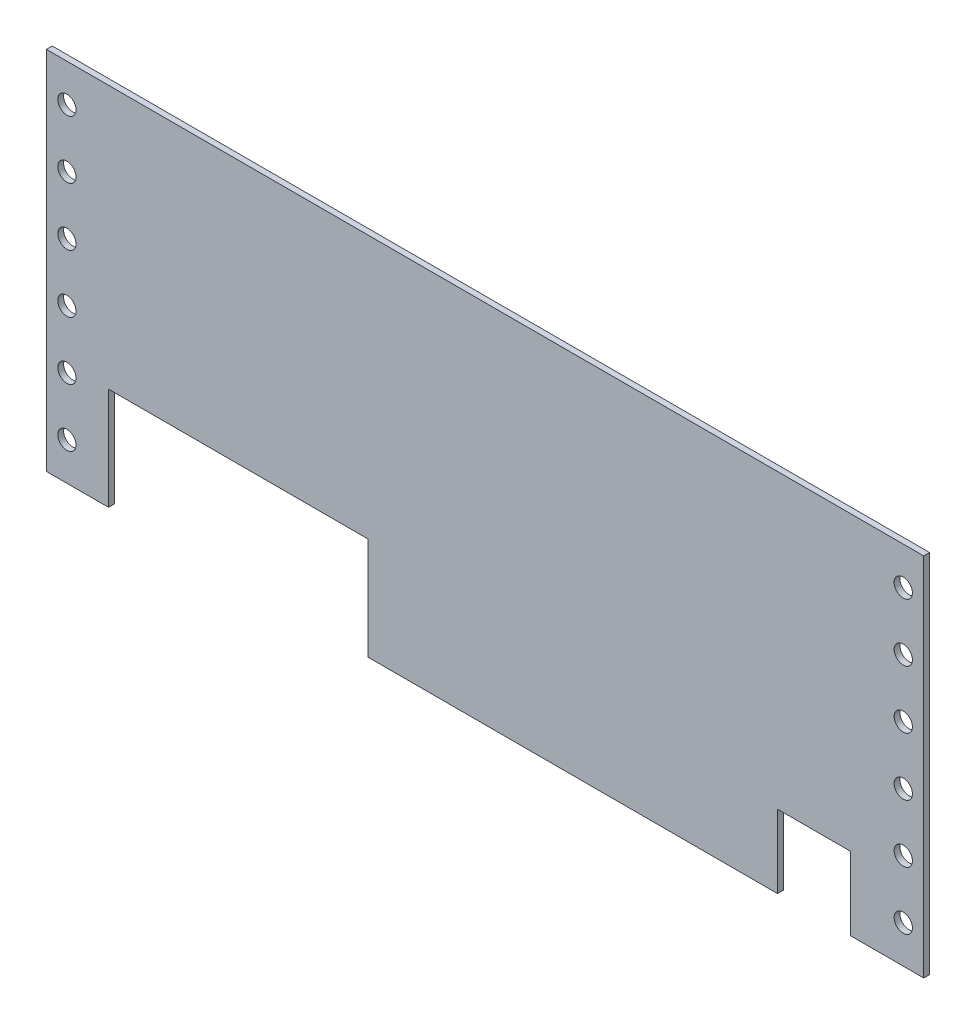
ISO-10303-21;
HEADER;
FILE_DESCRIPTION(('STEP AP214'),'2;1');
FILE_NAME('part.step','',(''),(''),'','','');
FILE_SCHEMA(('AUTOMOTIVE_DESIGN { 1 0 10303 214 1 1 1 1 }'));
ENDSEC;
DATA;
#1=APPLICATION_CONTEXT('core data for automotive mechanical design processes');
#2=APPLICATION_PROTOCOL_DEFINITION('international standard','automotive_design',2000,#1);
#3=PRODUCT_CONTEXT('',#1,'mechanical');
#4=PRODUCT('Part','Part','',(#3));
#5=PRODUCT_RELATED_PRODUCT_CATEGORY('part','',(#4));
#6=PRODUCT_DEFINITION_FORMATION('','',#4);
#7=PRODUCT_DEFINITION_CONTEXT('part definition',#1,'design');
#8=PRODUCT_DEFINITION('design','',#6,#7);
#9=PRODUCT_DEFINITION_SHAPE('','',#8);
#10=(LENGTH_UNIT() NAMED_UNIT(*) SI_UNIT(.MILLI.,.METRE.));
#11=(NAMED_UNIT(*) PLANE_ANGLE_UNIT() SI_UNIT($,.RADIAN.));
#12=(NAMED_UNIT(*) SI_UNIT($,.STERADIAN.) SOLID_ANGLE_UNIT());
#13=UNCERTAINTY_MEASURE_WITH_UNIT(LENGTH_MEASURE(1.E-05),#10,'distance_accuracy_value','');
#14=(GEOMETRIC_REPRESENTATION_CONTEXT(3) GLOBAL_UNCERTAINTY_ASSIGNED_CONTEXT((#13)) GLOBAL_UNIT_ASSIGNED_CONTEXT((#10,
#11,#12)) REPRESENTATION_CONTEXT('',''));
#15=CARTESIAN_POINT('',(0.,0.,0.));
#16=DIRECTION('',(0.,0.,1.));
#17=DIRECTION('',(1.,0.,0.));
#18=AXIS2_PLACEMENT_3D('',#15,#16,#17);
#19=CARTESIAN_POINT('',(0.,0.,1.6));
#20=DIRECTION('',(0.,1.,0.));
#21=DIRECTION('',(0.,0.,1.));
#22=AXIS2_PLACEMENT_3D('',#19,#20,#21);
#23=PLANE('',#22);
#24=DIRECTION('',(1.,0.,0.));
#25=VECTOR('',#24,1.);
#26=CARTESIAN_POINT('',(0.,0.,1.6));
#27=LINE('',#26,#25);
#28=CARTESIAN_POINT('',(220.,0.,1.6));
#29=VERTEX_POINT('',#28);
#30=CARTESIAN_POINT('',(240.,0.,1.6));
#31=VERTEX_POINT('',#30);
#32=EDGE_CURVE('E139',#29,#31,#27,.T.);
#33=ORIENTED_EDGE('',*,*,#32,.F.);
#34=DIRECTION('',(0.,0.,-1.));
#35=VECTOR('',#34,1.);
#36=CARTESIAN_POINT('',(220.,0.,1.601));
#37=LINE('',#36,#35);
#38=CARTESIAN_POINT('',(220.,0.,0.));
#39=VERTEX_POINT('',#38);
#40=EDGE_CURVE('E124',#29,#39,#37,.T.);
#41=ORIENTED_EDGE('',*,*,#40,.T.);
#42=DIRECTION('',(1.,0.,0.));
#43=VECTOR('',#42,1.);
#44=CARTESIAN_POINT('',(0.,0.,0.));
#45=LINE('',#44,#43);
#46=CARTESIAN_POINT('',(240.,0.,0.));
#47=VERTEX_POINT('',#46);
#48=EDGE_CURVE('E168',#39,#47,#45,.T.);
#49=ORIENTED_EDGE('',*,*,#48,.T.);
#50=DIRECTION('',(0.,0.,-1.));
#51=VECTOR('',#50,1.);
#52=CARTESIAN_POINT('',(240.,0.,1.6));
#53=LINE('',#52,#51);
#54=EDGE_CURVE('E146',#31,#47,#53,.T.);
#55=ORIENTED_EDGE('',*,*,#54,.F.);
#56=EDGE_LOOP('',(#33,#41,#49,#55));
#57=FACE_BOUND('',#56,.T.);
#58=ADVANCED_FACE('F34',(#57),#23,.F.);
#59=CARTESIAN_POINT('',(0.,0.,0.));
#60=VERTEX_POINT('',#59);
#61=CARTESIAN_POINT('',(17.,0.,0.));
#62=VERTEX_POINT('',#61);
#63=EDGE_CURVE('E170',#60,#62,#45,.T.);
#64=ORIENTED_EDGE('',*,*,#63,.T.);
#65=DIRECTION('',(0.,0.,1.));
#66=VECTOR('',#65,1.);
#67=CARTESIAN_POINT('',(17.,0.,-0.000999999999999916));
#68=LINE('',#67,#66);
#69=CARTESIAN_POINT('',(17.,0.,1.6));
#70=VERTEX_POINT('',#69);
#71=EDGE_CURVE('E290',#62,#70,#68,.T.);
#72=ORIENTED_EDGE('',*,*,#71,.T.);
#73=CARTESIAN_POINT('',(0.,0.,1.6));
#74=VERTEX_POINT('',#73);
#75=EDGE_CURVE('E151',#74,#70,#27,.T.);
#76=ORIENTED_EDGE('',*,*,#75,.F.);
#77=DIRECTION('',(0.,0.,-1.));
#78=VECTOR('',#77,1.);
#79=CARTESIAN_POINT('',(0.,0.,1.6));
#80=LINE('',#79,#78);
#81=EDGE_CURVE('E183',#74,#60,#80,.T.);
#82=ORIENTED_EDGE('',*,*,#81,.T.);
#83=EDGE_LOOP('',(#64,#72,#76,#82));
#84=FACE_BOUND('',#83,.T.);
#85=ADVANCED_FACE('F235',(#84),#23,.F.);
#86=CARTESIAN_POINT('',(234.4,89.7,-0.000999999999999916));
#87=DIRECTION('',(0.,0.,1.));
#88=DIRECTION('',(1.,0.,0.));
#89=AXIS2_PLACEMENT_3D('',#86,#87,#88);
#90=CYLINDRICAL_SURFACE('',#89,2.5);
#91=CARTESIAN_POINT('',(234.4,89.7,0.));
#92=DIRECTION('',(0.,0.,-1.));
#93=DIRECTION('',(-1.,0.,0.));
#94=AXIS2_PLACEMENT_3D('',#91,#92,#93);
#95=CIRCLE('',#94,2.5);
#96=CARTESIAN_POINT('',(231.9,89.7,0.));
#97=VERTEX_POINT('',#96);
#98=EDGE_CURVE('E42',#97,#97,#95,.F.);
#99=ORIENTED_EDGE('',*,*,#98,.F.);
#100=EDGE_LOOP('',(#99));
#101=FACE_BOUND('',#100,.T.);
#102=CARTESIAN_POINT('',(234.4,89.7,1.6));
#103=DIRECTION('',(0.,0.,1.));
#104=DIRECTION('',(1.,0.,0.));
#105=AXIS2_PLACEMENT_3D('',#102,#103,#104);
#106=CIRCLE('',#105,2.5);
#107=CARTESIAN_POINT('',(236.9,89.7,1.6));
#108=VERTEX_POINT('',#107);
#109=EDGE_CURVE('E11',#108,#108,#106,.T.);
#110=ORIENTED_EDGE('',*,*,#109,.T.);
#111=EDGE_LOOP('',(#110));
#112=FACE_BOUND('',#111,.T.);
#113=ADVANCED_FACE('F36',(#101,#112),#90,.F.);
#114=CARTESIAN_POINT('',(234.4,73.82,-0.000999999999999916));
#115=DIRECTION('',(0.,0.,1.));
#116=DIRECTION('',(1.,0.,0.));
#117=AXIS2_PLACEMENT_3D('',#114,#115,#116);
#118=CYLINDRICAL_SURFACE('',#117,2.5);
#119=CARTESIAN_POINT('',(234.4,73.82,0.));
#120=DIRECTION('',(0.,0.,-1.));
#121=DIRECTION('',(-1.,0.,0.));
#122=AXIS2_PLACEMENT_3D('',#119,#120,#121);
#123=CIRCLE('',#122,2.5);
#124=CARTESIAN_POINT('',(231.9,73.82,0.));
#125=VERTEX_POINT('',#124);
#126=EDGE_CURVE('E222',#125,#125,#123,.F.);
#127=ORIENTED_EDGE('',*,*,#126,.F.);
#128=EDGE_LOOP('',(#127));
#129=FACE_BOUND('',#128,.T.);
#130=CARTESIAN_POINT('',(234.4,73.82,1.6));
#131=DIRECTION('',(0.,0.,1.));
#132=DIRECTION('',(1.,0.,0.));
#133=AXIS2_PLACEMENT_3D('',#130,#131,#132);
#134=CIRCLE('',#133,2.5);
#135=CARTESIAN_POINT('',(236.9,73.82,1.6));
#136=VERTEX_POINT('',#135);
#137=EDGE_CURVE('E225',#136,#136,#134,.T.);
#138=ORIENTED_EDGE('',*,*,#137,.T.);
#139=EDGE_LOOP('',(#138));
#140=FACE_BOUND('',#139,.T.);
#141=ADVANCED_FACE('F234',(#129,#140),#118,.F.);
#142=CARTESIAN_POINT('',(234.4,57.94,-0.000999999999999916));
#143=DIRECTION('',(0.,0.,1.));
#144=DIRECTION('',(1.,0.,0.));
#145=AXIS2_PLACEMENT_3D('',#142,#143,#144);
#146=CYLINDRICAL_SURFACE('',#145,2.5);
#147=CARTESIAN_POINT('',(234.4,57.94,0.));
#148=DIRECTION('',(0.,0.,-1.));
#149=DIRECTION('',(-1.,0.,0.));
#150=AXIS2_PLACEMENT_3D('',#147,#148,#149);
#151=CIRCLE('',#150,2.5);
#152=CARTESIAN_POINT('',(231.9,57.94,0.));
#153=VERTEX_POINT('',#152);
#154=EDGE_CURVE('E216',#153,#153,#151,.F.);
#155=ORIENTED_EDGE('',*,*,#154,.F.);
#156=EDGE_LOOP('',(#155));
#157=FACE_BOUND('',#156,.T.);
#158=CARTESIAN_POINT('',(234.4,57.94,1.6));
#159=DIRECTION('',(0.,0.,1.));
#160=DIRECTION('',(1.,0.,0.));
#161=AXIS2_PLACEMENT_3D('',#158,#159,#160);
#162=CIRCLE('',#161,2.5);
#163=CARTESIAN_POINT('',(236.9,57.94,1.6));
#164=VERTEX_POINT('',#163);
#165=EDGE_CURVE('E219',#164,#164,#162,.T.);
#166=ORIENTED_EDGE('',*,*,#165,.T.);
#167=EDGE_LOOP('',(#166));
#168=FACE_BOUND('',#167,.T.);
#169=ADVANCED_FACE('F488',(#157,#168),#146,.F.);
#170=CARTESIAN_POINT('',(234.4,42.06,-0.000999999999999916));
#171=DIRECTION('',(0.,0.,1.));
#172=DIRECTION('',(1.,0.,0.));
#173=AXIS2_PLACEMENT_3D('',#170,#171,#172);
#174=CYLINDRICAL_SURFACE('',#173,2.5);
#175=CARTESIAN_POINT('',(234.4,42.06,0.));
#176=DIRECTION('',(0.,0.,-1.));
#177=DIRECTION('',(-1.,0.,0.));
#178=AXIS2_PLACEMENT_3D('',#175,#176,#177);
#179=CIRCLE('',#178,2.5);
#180=CARTESIAN_POINT('',(231.9,42.06,0.));
#181=VERTEX_POINT('',#180);
#182=EDGE_CURVE('E210',#181,#181,#179,.F.);
#183=ORIENTED_EDGE('',*,*,#182,.F.);
#184=EDGE_LOOP('',(#183));
#185=FACE_BOUND('',#184,.T.);
#186=CARTESIAN_POINT('',(234.4,42.06,1.6));
#187=DIRECTION('',(0.,0.,1.));
#188=DIRECTION('',(1.,0.,0.));
#189=AXIS2_PLACEMENT_3D('',#186,#187,#188);
#190=CIRCLE('',#189,2.5);
#191=CARTESIAN_POINT('',(236.9,42.06,1.6));
#192=VERTEX_POINT('',#191);
#193=EDGE_CURVE('E213',#192,#192,#190,.T.);
#194=ORIENTED_EDGE('',*,*,#193,.T.);
#195=EDGE_LOOP('',(#194));
#196=FACE_BOUND('',#195,.T.);
#197=ADVANCED_FACE('F479',(#185,#196),#174,.F.);
#198=CARTESIAN_POINT('',(5.6,89.7,-0.000999999999999916));
#199=DIRECTION('',(0.,0.,1.));
#200=DIRECTION('',(1.,0.,0.));
#201=AXIS2_PLACEMENT_3D('',#198,#199,#200);
#202=CYLINDRICAL_SURFACE('',#201,2.5);
#203=CARTESIAN_POINT('',(5.6,89.7,0.));
#204=DIRECTION('',(0.,0.,-1.));
#205=DIRECTION('',(-1.,0.,0.));
#206=AXIS2_PLACEMENT_3D('',#203,#204,#205);
#207=CIRCLE('',#206,2.5);
#208=CARTESIAN_POINT('',(3.1,89.7,0.));
#209=VERTEX_POINT('',#208);
#210=EDGE_CURVE('E204',#209,#209,#207,.F.);
#211=ORIENTED_EDGE('',*,*,#210,.F.);
#212=EDGE_LOOP('',(#211));
#213=FACE_BOUND('',#212,.T.);
#214=CARTESIAN_POINT('',(5.6,89.7,1.6));
#215=DIRECTION('',(0.,0.,1.));
#216=DIRECTION('',(1.,0.,0.));
#217=AXIS2_PLACEMENT_3D('',#214,#215,#216);
#218=CIRCLE('',#217,2.5);
#219=CARTESIAN_POINT('',(8.1,89.7,1.6));
#220=VERTEX_POINT('',#219);
#221=EDGE_CURVE('E207',#220,#220,#218,.T.);
#222=ORIENTED_EDGE('',*,*,#221,.T.);
#223=EDGE_LOOP('',(#222));
#224=FACE_BOUND('',#223,.T.);
#225=ADVANCED_FACE('F470',(#213,#224),#202,.F.);
#226=CARTESIAN_POINT('',(5.6,73.82,-0.000999999999999916));
#227=DIRECTION('',(0.,0.,1.));
#228=DIRECTION('',(1.,0.,0.));
#229=AXIS2_PLACEMENT_3D('',#226,#227,#228);
#230=CYLINDRICAL_SURFACE('',#229,2.5);
#231=CARTESIAN_POINT('',(5.6,73.82,0.));
#232=DIRECTION('',(0.,0.,-1.));
#233=DIRECTION('',(-1.,0.,0.));
#234=AXIS2_PLACEMENT_3D('',#231,#232,#233);
#235=CIRCLE('',#234,2.5);
#236=CARTESIAN_POINT('',(3.1,73.82,0.));
#237=VERTEX_POINT('',#236);
#238=EDGE_CURVE('E198',#237,#237,#235,.F.);
#239=ORIENTED_EDGE('',*,*,#238,.F.);
#240=EDGE_LOOP('',(#239));
#241=FACE_BOUND('',#240,.T.);
#242=CARTESIAN_POINT('',(5.6,73.82,1.6));
#243=DIRECTION('',(0.,0.,1.));
#244=DIRECTION('',(1.,0.,0.));
#245=AXIS2_PLACEMENT_3D('',#242,#243,#244);
#246=CIRCLE('',#245,2.5);
#247=CARTESIAN_POINT('',(8.1,73.82,1.6));
#248=VERTEX_POINT('',#247);
#249=EDGE_CURVE('E201',#248,#248,#246,.T.);
#250=ORIENTED_EDGE('',*,*,#249,.T.);
#251=EDGE_LOOP('',(#250));
#252=FACE_BOUND('',#251,.T.);
#253=ADVANCED_FACE('F461',(#241,#252),#230,.F.);
#254=CARTESIAN_POINT('',(5.6,57.94,-0.000999999999999916));
#255=DIRECTION('',(0.,0.,1.));
#256=DIRECTION('',(1.,0.,0.));
#257=AXIS2_PLACEMENT_3D('',#254,#255,#256);
#258=CYLINDRICAL_SURFACE('',#257,2.5);
#259=CARTESIAN_POINT('',(5.6,57.94,0.));
#260=DIRECTION('',(0.,0.,-1.));
#261=DIRECTION('',(-1.,0.,0.));
#262=AXIS2_PLACEMENT_3D('',#259,#260,#261);
#263=CIRCLE('',#262,2.5);
#264=CARTESIAN_POINT('',(3.1,57.94,0.));
#265=VERTEX_POINT('',#264);
#266=EDGE_CURVE('E192',#265,#265,#263,.F.);
#267=ORIENTED_EDGE('',*,*,#266,.F.);
#268=EDGE_LOOP('',(#267));
#269=FACE_BOUND('',#268,.T.);
#270=CARTESIAN_POINT('',(5.6,57.94,1.6));
#271=DIRECTION('',(0.,0.,1.));
#272=DIRECTION('',(1.,0.,0.));
#273=AXIS2_PLACEMENT_3D('',#270,#271,#272);
#274=CIRCLE('',#273,2.5);
#275=CARTESIAN_POINT('',(8.1,57.94,1.6));
#276=VERTEX_POINT('',#275);
#277=EDGE_CURVE('E195',#276,#276,#274,.T.);
#278=ORIENTED_EDGE('',*,*,#277,.T.);
#279=EDGE_LOOP('',(#278));
#280=FACE_BOUND('',#279,.T.);
#281=ADVANCED_FACE('F452',(#269,#280),#258,.F.);
#282=CARTESIAN_POINT('',(5.6,42.06,-0.000999999999999916));
#283=DIRECTION('',(0.,0.,1.));
#284=DIRECTION('',(1.,0.,0.));
#285=AXIS2_PLACEMENT_3D('',#282,#283,#284);
#286=CYLINDRICAL_SURFACE('',#285,2.5);
#287=CARTESIAN_POINT('',(5.6,42.06,0.));
#288=DIRECTION('',(0.,0.,-1.));
#289=DIRECTION('',(-1.,0.,0.));
#290=AXIS2_PLACEMENT_3D('',#287,#288,#289);
#291=CIRCLE('',#290,2.5);
#292=CARTESIAN_POINT('',(3.1,42.06,0.));
#293=VERTEX_POINT('',#292);
#294=EDGE_CURVE('E186',#293,#293,#291,.F.);
#295=ORIENTED_EDGE('',*,*,#294,.F.);
#296=EDGE_LOOP('',(#295));
#297=FACE_BOUND('',#296,.T.);
#298=CARTESIAN_POINT('',(5.6,42.06,1.6));
#299=DIRECTION('',(0.,0.,1.));
#300=DIRECTION('',(1.,0.,0.));
#301=AXIS2_PLACEMENT_3D('',#298,#299,#300);
#302=CIRCLE('',#301,2.5);
#303=CARTESIAN_POINT('',(8.1,42.06,1.6));
#304=VERTEX_POINT('',#303);
#305=EDGE_CURVE('E189',#304,#304,#302,.T.);
#306=ORIENTED_EDGE('',*,*,#305,.T.);
#307=EDGE_LOOP('',(#306));
#308=FACE_BOUND('',#307,.T.);
#309=ADVANCED_FACE('F273',(#297,#308),#286,.F.);
#310=CARTESIAN_POINT('',(0.,0.,1.6));
#311=DIRECTION('',(1.,0.,0.));
#312=DIRECTION('',(0.,0.,-1.));
#313=AXIS2_PLACEMENT_3D('',#310,#311,#312);
#314=PLANE('',#313);
#315=DIRECTION('',(0.,-1.,0.));
#316=VECTOR('',#315,1.);
#317=CARTESIAN_POINT('',(0.,0.,0.));
#318=LINE('',#317,#316);
#319=CARTESIAN_POINT('',(0.,100.,0.));
#320=VERTEX_POINT('',#319);
#321=EDGE_CURVE('E165',#320,#60,#318,.T.);
#322=ORIENTED_EDGE('',*,*,#321,.T.);
#323=ORIENTED_EDGE('',*,*,#81,.F.);
#324=DIRECTION('',(0.,-1.,0.));
#325=VECTOR('',#324,1.);
#326=CARTESIAN_POINT('',(0.,0.,1.6));
#327=LINE('',#326,#325);
#328=CARTESIAN_POINT('',(0.,100.,1.6));
#329=VERTEX_POINT('',#328);
#330=EDGE_CURVE('E149',#329,#74,#327,.T.);
#331=ORIENTED_EDGE('',*,*,#330,.F.);
#332=DIRECTION('',(0.,0.,-1.));
#333=VECTOR('',#332,1.);
#334=CARTESIAN_POINT('',(0.,100.,1.6));
#335=LINE('',#334,#333);
#336=EDGE_CURVE('E162',#329,#320,#335,.T.);
#337=ORIENTED_EDGE('',*,*,#336,.T.);
#338=EDGE_LOOP('',(#322,#323,#331,#337));
#339=FACE_BOUND('',#338,.T.);
#340=ADVANCED_FACE('F266',(#339),#314,.F.);
#341=CARTESIAN_POINT('',(88.,0.,0.));
#342=VERTEX_POINT('',#341);
#343=CARTESIAN_POINT('',(200.,0.,0.));
#344=VERTEX_POINT('',#343);
#345=EDGE_CURVE('E174',#342,#344,#45,.T.);
#346=ORIENTED_EDGE('',*,*,#345,.T.);
#347=DIRECTION('',(0.,0.,-1.));
#348=VECTOR('',#347,1.);
#349=CARTESIAN_POINT('',(200.,0.,1.601));
#350=LINE('',#349,#348);
#351=CARTESIAN_POINT('',(200.,0.,1.6));
#352=VERTEX_POINT('',#351);
#353=EDGE_CURVE('E49',#352,#344,#350,.T.);
#354=ORIENTED_EDGE('',*,*,#353,.F.);
#355=CARTESIAN_POINT('',(88.,0.,1.6));
#356=VERTEX_POINT('',#355);
#357=EDGE_CURVE('E148',#356,#352,#27,.T.);
#358=ORIENTED_EDGE('',*,*,#357,.F.);
#359=DIRECTION('',(0.,0.,1.));
#360=VECTOR('',#359,1.);
#361=CARTESIAN_POINT('',(88.,0.,-0.000999999999999916));
#362=LINE('',#361,#360);
#363=EDGE_CURVE('E279',#342,#356,#362,.T.);
#364=ORIENTED_EDGE('',*,*,#363,.F.);
#365=EDGE_LOOP('',(#346,#354,#358,#364));
#366=FACE_BOUND('',#365,.T.);
#367=ADVANCED_FACE('F258',(#366),#23,.F.);
#368=CARTESIAN_POINT('',(240.,0.,1.6));
#369=DIRECTION('',(-1.,0.,0.));
#370=DIRECTION('',(0.,0.,1.));
#371=AXIS2_PLACEMENT_3D('',#368,#369,#370);
#372=PLANE('',#371);
#373=DIRECTION('',(0.,1.,0.));
#374=VECTOR('',#373,1.);
#375=CARTESIAN_POINT('',(240.,0.,0.));
#376=LINE('',#375,#374);
#377=CARTESIAN_POINT('',(240.,100.,0.));
#378=VERTEX_POINT('',#377);
#379=EDGE_CURVE('E173',#47,#378,#376,.T.);
#380=ORIENTED_EDGE('',*,*,#379,.T.);
#381=DIRECTION('',(0.,0.,-1.));
#382=VECTOR('',#381,1.);
#383=CARTESIAN_POINT('',(240.,100.,1.6));
#384=LINE('',#383,#382);
#385=CARTESIAN_POINT('',(240.,100.,1.6));
#386=VERTEX_POINT('',#385);
#387=EDGE_CURVE('E179',#386,#378,#384,.T.);
#388=ORIENTED_EDGE('',*,*,#387,.F.);
#389=DIRECTION('',(0.,1.,0.));
#390=VECTOR('',#389,1.);
#391=CARTESIAN_POINT('',(240.,0.,1.6));
#392=LINE('',#391,#390);
#393=EDGE_CURVE('E158',#31,#386,#392,.T.);
#394=ORIENTED_EDGE('',*,*,#393,.F.);
#395=ORIENTED_EDGE('',*,*,#54,.T.);
#396=EDGE_LOOP('',(#380,#388,#394,#395));
#397=FACE_BOUND('',#396,.T.);
#398=ADVANCED_FACE('F250',(#397),#372,.F.);
#399=CARTESIAN_POINT('',(0.,100.,1.6));
#400=DIRECTION('',(0.,-1.,0.));
#401=DIRECTION('',(0.,0.,-1.));
#402=AXIS2_PLACEMENT_3D('',#399,#400,#401);
#403=PLANE('',#402);
#404=DIRECTION('',(-1.,0.,0.));
#405=VECTOR('',#404,1.);
#406=CARTESIAN_POINT('',(0.,100.,0.));
#407=LINE('',#406,#405);
#408=EDGE_CURVE('E154',#378,#320,#407,.T.);
#409=ORIENTED_EDGE('',*,*,#408,.T.);
#410=ORIENTED_EDGE('',*,*,#336,.F.);
#411=DIRECTION('',(-1.,0.,0.));
#412=VECTOR('',#411,1.);
#413=CARTESIAN_POINT('',(0.,100.,1.6));
#414=LINE('',#413,#412);
#415=EDGE_CURVE('E160',#386,#329,#414,.T.);
#416=ORIENTED_EDGE('',*,*,#415,.F.);
#417=ORIENTED_EDGE('',*,*,#387,.T.);
#418=EDGE_LOOP('',(#409,#410,#416,#417));
#419=FACE_BOUND('',#418,.T.);
#420=ADVANCED_FACE('F239',(#419),#403,.F.);
#421=CARTESIAN_POINT('',(0.,0.,1.6));
#422=DIRECTION('',(0.,0.,-1.));
#423=DIRECTION('',(-1.,0.,0.));
#424=AXIS2_PLACEMENT_3D('',#421,#422,#423);
#425=PLANE('',#424);
#426=CARTESIAN_POINT('',(234.4,26.18,1.6));
#427=DIRECTION('',(0.,0.,1.));
#428=DIRECTION('',(1.,0.,0.));
#429=AXIS2_PLACEMENT_3D('',#426,#427,#428);
#430=CIRCLE('',#429,2.5);
#431=CARTESIAN_POINT('',(236.9,26.18,1.6));
#432=VERTEX_POINT('',#431);
#433=EDGE_CURVE('E304',#432,#432,#430,.T.);
#434=ORIENTED_EDGE('',*,*,#433,.F.);
#435=EDGE_LOOP('',(#434));
#436=FACE_BOUND('',#435,.T.);
#437=CARTESIAN_POINT('',(5.6,26.18,1.6));
#438=DIRECTION('',(0.,0.,1.));
#439=DIRECTION('',(1.,0.,0.));
#440=AXIS2_PLACEMENT_3D('',#437,#438,#439);
#441=CIRCLE('',#440,2.5);
#442=CARTESIAN_POINT('',(8.1,26.18,1.6));
#443=VERTEX_POINT('',#442);
#444=EDGE_CURVE('E311',#443,#443,#441,.T.);
#445=ORIENTED_EDGE('',*,*,#444,.F.);
#446=EDGE_LOOP('',(#445));
#447=FACE_BOUND('',#446,.T.);
#448=CARTESIAN_POINT('',(5.6,10.3,1.6));
#449=DIRECTION('',(0.,0.,1.));
#450=DIRECTION('',(1.,0.,0.));
#451=AXIS2_PLACEMENT_3D('',#448,#449,#450);
#452=CIRCLE('',#451,2.5);
#453=CARTESIAN_POINT('',(8.1,10.3,1.6));
#454=VERTEX_POINT('',#453);
#455=EDGE_CURVE('E169',#454,#454,#452,.T.);
#456=ORIENTED_EDGE('',*,*,#455,.F.);
#457=EDGE_LOOP('',(#456));
#458=FACE_BOUND('',#457,.T.);
#459=CARTESIAN_POINT('',(234.4,10.3,1.6));
#460=DIRECTION('',(0.,0.,1.));
#461=DIRECTION('',(1.,0.,0.));
#462=AXIS2_PLACEMENT_3D('',#459,#460,#461);
#463=CIRCLE('',#462,2.5);
#464=CARTESIAN_POINT('',(236.9,10.3,1.6));
#465=VERTEX_POINT('',#464);
#466=EDGE_CURVE('E320',#465,#465,#463,.T.);
#467=ORIENTED_EDGE('',*,*,#466,.F.);
#468=EDGE_LOOP('',(#467));
#469=FACE_BOUND('',#468,.T.);
#470=DIRECTION('',(-1.,0.,0.));
#471=VECTOR('',#470,1.);
#472=CARTESIAN_POINT('',(220.,20.,1.6));
#473=LINE('',#472,#471);
#474=CARTESIAN_POINT('',(220.,20.,1.6));
#475=VERTEX_POINT('',#474);
#476=CARTESIAN_POINT('',(200.,20.,1.6));
#477=VERTEX_POINT('',#476);
#478=EDGE_CURVE('E143',#475,#477,#473,.T.);
#479=ORIENTED_EDGE('',*,*,#478,.F.);
#480=DIRECTION('',(0.,1.,0.));
#481=VECTOR('',#480,1.);
#482=CARTESIAN_POINT('',(220.,0.,1.6));
#483=LINE('',#482,#481);
#484=EDGE_CURVE('E127',#29,#475,#483,.T.);
#485=ORIENTED_EDGE('',*,*,#484,.F.);
#486=ORIENTED_EDGE('',*,*,#32,.T.);
#487=ORIENTED_EDGE('',*,*,#393,.T.);
#488=ORIENTED_EDGE('',*,*,#415,.T.);
#489=ORIENTED_EDGE('',*,*,#330,.T.);
#490=ORIENTED_EDGE('',*,*,#75,.T.);
#491=DIRECTION('',(0.,-1.,0.));
#492=VECTOR('',#491,1.);
#493=CARTESIAN_POINT('',(17.,28.,1.6));
#494=LINE('',#493,#492);
#495=CARTESIAN_POINT('',(17.,28.,1.6));
#496=VERTEX_POINT('',#495);
#497=EDGE_CURVE('E390',#496,#70,#494,.T.);
#498=ORIENTED_EDGE('',*,*,#497,.F.);
#499=DIRECTION('',(-1.,0.,0.));
#500=VECTOR('',#499,1.);
#501=CARTESIAN_POINT('',(17.,28.,1.6));
#502=LINE('',#501,#500);
#503=CARTESIAN_POINT('',(88.,28.,1.6));
#504=VERTEX_POINT('',#503);
#505=EDGE_CURVE('E293',#504,#496,#502,.T.);
#506=ORIENTED_EDGE('',*,*,#505,.F.);
#507=DIRECTION('',(0.,1.,0.));
#508=VECTOR('',#507,1.);
#509=CARTESIAN_POINT('',(88.,28.,1.6));
#510=LINE('',#509,#508);
#511=EDGE_CURVE('E297',#356,#504,#510,.T.);
#512=ORIENTED_EDGE('',*,*,#511,.F.);
#513=ORIENTED_EDGE('',*,*,#357,.T.);
#514=DIRECTION('',(0.,-1.,0.));
#515=VECTOR('',#514,1.);
#516=CARTESIAN_POINT('',(200.,0.,1.6));
#517=LINE('',#516,#515);
#518=EDGE_CURVE('E371',#477,#352,#517,.T.);
#519=ORIENTED_EDGE('',*,*,#518,.F.);
#520=EDGE_LOOP('',(#479,#485,#486,#487,#488,#489,#490,#498,#506,#512,#513,#519));
#521=FACE_BOUND('',#520,.T.);
#522=ORIENTED_EDGE('',*,*,#305,.F.);
#523=EDGE_LOOP('',(#522));
#524=FACE_BOUND('',#523,.T.);
#525=ORIENTED_EDGE('',*,*,#277,.F.);
#526=EDGE_LOOP('',(#525));
#527=FACE_BOUND('',#526,.T.);
#528=ORIENTED_EDGE('',*,*,#249,.F.);
#529=EDGE_LOOP('',(#528));
#530=FACE_BOUND('',#529,.T.);
#531=ORIENTED_EDGE('',*,*,#221,.F.);
#532=EDGE_LOOP('',(#531));
#533=FACE_BOUND('',#532,.T.);
#534=ORIENTED_EDGE('',*,*,#193,.F.);
#535=EDGE_LOOP('',(#534));
#536=FACE_BOUND('',#535,.T.);
#537=ORIENTED_EDGE('',*,*,#165,.F.);
#538=EDGE_LOOP('',(#537));
#539=FACE_BOUND('',#538,.T.);
#540=ORIENTED_EDGE('',*,*,#137,.F.);
#541=EDGE_LOOP('',(#540));
#542=FACE_BOUND('',#541,.T.);
#543=ORIENTED_EDGE('',*,*,#109,.F.);
#544=EDGE_LOOP('',(#543));
#545=FACE_BOUND('',#544,.T.);
#546=ADVANCED_FACE('F137',(#436,#447,#458,#469,#521,#524,#527,#530,#533,#536,#539,#542,#545),
#425,.F.);
#547=CARTESIAN_POINT('',(0.,0.,0.));
#548=DIRECTION('',(0.,0.,-1.));
#549=DIRECTION('',(-1.,0.,0.));
#550=AXIS2_PLACEMENT_3D('',#547,#548,#549);
#551=PLANE('',#550);
#552=DIRECTION('',(0.,-1.,0.));
#553=VECTOR('',#552,1.);
#554=CARTESIAN_POINT('',(220.,0.,0.));
#555=LINE('',#554,#553);
#556=CARTESIAN_POINT('',(220.,20.,0.));
#557=VERTEX_POINT('',#556);
#558=EDGE_CURVE('E130',#557,#39,#555,.T.);
#559=ORIENTED_EDGE('',*,*,#558,.F.);
#560=DIRECTION('',(1.,0.,0.));
#561=VECTOR('',#560,1.);
#562=CARTESIAN_POINT('',(220.,20.,0.));
#563=LINE('',#562,#561);
#564=CARTESIAN_POINT('',(200.,20.,0.));
#565=VERTEX_POINT('',#564);
#566=EDGE_CURVE('E134',#565,#557,#563,.T.);
#567=ORIENTED_EDGE('',*,*,#566,.F.);
#568=DIRECTION('',(0.,1.,0.));
#569=VECTOR('',#568,1.);
#570=CARTESIAN_POINT('',(200.,0.,0.));
#571=LINE('',#570,#569);
#572=EDGE_CURVE('E377',#344,#565,#571,.T.);
#573=ORIENTED_EDGE('',*,*,#572,.F.);
#574=ORIENTED_EDGE('',*,*,#345,.F.);
#575=DIRECTION('',(0.,1.,0.));
#576=VECTOR('',#575,1.);
#577=CARTESIAN_POINT('',(88.,28.,0.));
#578=LINE('',#577,#576);
#579=CARTESIAN_POINT('',(88.,28.,0.));
#580=VERTEX_POINT('',#579);
#581=EDGE_CURVE('E381',#342,#580,#578,.T.);
#582=ORIENTED_EDGE('',*,*,#581,.T.);
#583=DIRECTION('',(-1.,0.,0.));
#584=VECTOR('',#583,1.);
#585=CARTESIAN_POINT('',(17.,28.,0.));
#586=LINE('',#585,#584);
#587=CARTESIAN_POINT('',(17.,28.,0.));
#588=VERTEX_POINT('',#587);
#589=EDGE_CURVE('E385',#580,#588,#586,.T.);
#590=ORIENTED_EDGE('',*,*,#589,.T.);
#591=DIRECTION('',(0.,-1.,0.));
#592=VECTOR('',#591,1.);
#593=CARTESIAN_POINT('',(17.,28.,0.));
#594=LINE('',#593,#592);
#595=EDGE_CURVE('E388',#588,#62,#594,.T.);
#596=ORIENTED_EDGE('',*,*,#595,.T.);
#597=ORIENTED_EDGE('',*,*,#63,.F.);
#598=ORIENTED_EDGE('',*,*,#321,.F.);
#599=ORIENTED_EDGE('',*,*,#408,.F.);
#600=ORIENTED_EDGE('',*,*,#379,.F.);
#601=ORIENTED_EDGE('',*,*,#48,.F.);
#602=EDGE_LOOP('',(#559,#567,#573,#574,#582,#590,#596,#597,#598,#599,#600,#601));
#603=FACE_BOUND('',#602,.T.);
#604=CARTESIAN_POINT('',(234.4,26.18,0.));
#605=DIRECTION('',(0.,0.,-1.));
#606=DIRECTION('',(-1.,0.,0.));
#607=AXIS2_PLACEMENT_3D('',#604,#605,#606);
#608=CIRCLE('',#607,2.5);
#609=CARTESIAN_POINT('',(231.9,26.18,0.));
#610=VERTEX_POINT('',#609);
#611=EDGE_CURVE('E301',#610,#610,#608,.F.);
#612=ORIENTED_EDGE('',*,*,#611,.T.);
#613=EDGE_LOOP('',(#612));
#614=FACE_BOUND('',#613,.T.);
#615=CARTESIAN_POINT('',(5.6,26.18,0.));
#616=DIRECTION('',(0.,0.,-1.));
#617=DIRECTION('',(-1.,0.,0.));
#618=AXIS2_PLACEMENT_3D('',#615,#616,#617);
#619=CIRCLE('',#618,2.5);
#620=CARTESIAN_POINT('',(3.1,26.18,0.));
#621=VERTEX_POINT('',#620);
#622=EDGE_CURVE('E308',#621,#621,#619,.F.);
#623=ORIENTED_EDGE('',*,*,#622,.T.);
#624=EDGE_LOOP('',(#623));
#625=FACE_BOUND('',#624,.T.);
#626=CARTESIAN_POINT('',(5.6,10.3,0.));
#627=DIRECTION('',(0.,0.,-1.));
#628=DIRECTION('',(-1.,0.,0.));
#629=AXIS2_PLACEMENT_3D('',#626,#627,#628);
#630=CIRCLE('',#629,2.5);
#631=CARTESIAN_POINT('',(3.1,10.3,0.));
#632=VERTEX_POINT('',#631);
#633=EDGE_CURVE('E317',#632,#632,#630,.F.);
#634=ORIENTED_EDGE('',*,*,#633,.T.);
#635=EDGE_LOOP('',(#634));
#636=FACE_BOUND('',#635,.T.);
#637=CARTESIAN_POINT('',(234.4,10.3,0.));
#638=DIRECTION('',(0.,0.,-1.));
#639=DIRECTION('',(-1.,0.,0.));
#640=AXIS2_PLACEMENT_3D('',#637,#638,#639);
#641=CIRCLE('',#640,2.5);
#642=CARTESIAN_POINT('',(231.9,10.3,0.));
#643=VERTEX_POINT('',#642);
#644=EDGE_CURVE('E314',#643,#643,#641,.F.);
#645=ORIENTED_EDGE('',*,*,#644,.T.);
#646=EDGE_LOOP('',(#645));
#647=FACE_BOUND('',#646,.T.);
#648=ORIENTED_EDGE('',*,*,#294,.T.);
#649=EDGE_LOOP('',(#648));
#650=FACE_BOUND('',#649,.T.);
#651=ORIENTED_EDGE('',*,*,#266,.T.);
#652=EDGE_LOOP('',(#651));
#653=FACE_BOUND('',#652,.T.);
#654=ORIENTED_EDGE('',*,*,#238,.T.);
#655=EDGE_LOOP('',(#654));
#656=FACE_BOUND('',#655,.T.);
#657=ORIENTED_EDGE('',*,*,#210,.T.);
#658=EDGE_LOOP('',(#657));
#659=FACE_BOUND('',#658,.T.);
#660=ORIENTED_EDGE('',*,*,#182,.T.);
#661=EDGE_LOOP('',(#660));
#662=FACE_BOUND('',#661,.T.);
#663=ORIENTED_EDGE('',*,*,#154,.T.);
#664=EDGE_LOOP('',(#663));
#665=FACE_BOUND('',#664,.T.);
#666=ORIENTED_EDGE('',*,*,#126,.T.);
#667=EDGE_LOOP('',(#666));
#668=FACE_BOUND('',#667,.T.);
#669=ORIENTED_EDGE('',*,*,#98,.T.);
#670=EDGE_LOOP('',(#669));
#671=FACE_BOUND('',#670,.T.);
#672=ADVANCED_FACE('F230',(#603,#614,#625,#636,#647,#650,#653,#656,#659,#662,#665,#668,#671),
#551,.T.);
#673=CARTESIAN_POINT('',(234.4,10.3,-0.000999999999999916));
#674=DIRECTION('',(0.,0.,1.));
#675=DIRECTION('',(1.,0.,0.));
#676=AXIS2_PLACEMENT_3D('',#673,#674,#675);
#677=CYLINDRICAL_SURFACE('',#676,2.5);
#678=ORIENTED_EDGE('',*,*,#644,.F.);
#679=EDGE_LOOP('',(#678));
#680=FACE_BOUND('',#679,.T.);
#681=ORIENTED_EDGE('',*,*,#466,.T.);
#682=EDGE_LOOP('',(#681));
#683=FACE_BOUND('',#682,.T.);
#684=ADVANCED_FACE('F246',(#680,#683),#677,.F.);
#685=CARTESIAN_POINT('',(5.6,10.3,-0.000999999999999916));
#686=DIRECTION('',(0.,0.,1.));
#687=DIRECTION('',(1.,0.,0.));
#688=AXIS2_PLACEMENT_3D('',#685,#686,#687);
#689=CYLINDRICAL_SURFACE('',#688,2.5);
#690=ORIENTED_EDGE('',*,*,#633,.F.);
#691=EDGE_LOOP('',(#690));
#692=FACE_BOUND('',#691,.T.);
#693=ORIENTED_EDGE('',*,*,#455,.T.);
#694=EDGE_LOOP('',(#693));
#695=FACE_BOUND('',#694,.T.);
#696=ADVANCED_FACE('F330',(#692,#695),#689,.F.);
#697=CARTESIAN_POINT('',(5.6,26.18,-0.000999999999999916));
#698=DIRECTION('',(0.,0.,1.));
#699=DIRECTION('',(1.,0.,0.));
#700=AXIS2_PLACEMENT_3D('',#697,#698,#699);
#701=CYLINDRICAL_SURFACE('',#700,2.5);
#702=ORIENTED_EDGE('',*,*,#622,.F.);
#703=EDGE_LOOP('',(#702));
#704=FACE_BOUND('',#703,.T.);
#705=ORIENTED_EDGE('',*,*,#444,.T.);
#706=EDGE_LOOP('',(#705));
#707=FACE_BOUND('',#706,.T.);
#708=ADVANCED_FACE('F337',(#704,#707),#701,.F.);
#709=CARTESIAN_POINT('',(234.4,26.18,-0.000999999999999916));
#710=DIRECTION('',(0.,0.,1.));
#711=DIRECTION('',(1.,0.,0.));
#712=AXIS2_PLACEMENT_3D('',#709,#710,#711);
#713=CYLINDRICAL_SURFACE('',#712,2.5);
#714=ORIENTED_EDGE('',*,*,#611,.F.);
#715=EDGE_LOOP('',(#714));
#716=FACE_BOUND('',#715,.T.);
#717=ORIENTED_EDGE('',*,*,#433,.T.);
#718=EDGE_LOOP('',(#717));
#719=FACE_BOUND('',#718,.T.);
#720=ADVANCED_FACE('F343',(#716,#719),#713,.F.);
#721=CARTESIAN_POINT('',(17.,28.,-0.000999999999999916));
#722=DIRECTION('',(-1.,0.,0.));
#723=DIRECTION('',(0.,-1.,0.));
#724=AXIS2_PLACEMENT_3D('',#721,#722,#723);
#725=PLANE('',#724);
#726=DIRECTION('',(0.,0.,1.));
#727=VECTOR('',#726,1.);
#728=CARTESIAN_POINT('',(17.,28.,-0.000999999999999916));
#729=LINE('',#728,#727);
#730=EDGE_CURVE('E305',#588,#496,#729,.T.);
#731=ORIENTED_EDGE('',*,*,#730,.T.);
#732=ORIENTED_EDGE('',*,*,#497,.T.);
#733=ORIENTED_EDGE('',*,*,#71,.F.);
#734=ORIENTED_EDGE('',*,*,#595,.F.);
#735=EDGE_LOOP('',(#731,#732,#733,#734));
#736=FACE_BOUND('',#735,.T.);
#737=ADVANCED_FACE('F347',(#736),#725,.F.);
#738=CARTESIAN_POINT('',(17.,28.,-0.000999999999999916));
#739=DIRECTION('',(0.,1.,0.));
#740=DIRECTION('',(-1.,0.,0.));
#741=AXIS2_PLACEMENT_3D('',#738,#739,#740);
#742=PLANE('',#741);
#743=DIRECTION('',(0.,0.,1.));
#744=VECTOR('',#743,1.);
#745=CARTESIAN_POINT('',(88.,28.,-0.000999999999999916));
#746=LINE('',#745,#744);
#747=EDGE_CURVE('E57',#580,#504,#746,.T.);
#748=ORIENTED_EDGE('',*,*,#747,.T.);
#749=ORIENTED_EDGE('',*,*,#505,.T.);
#750=ORIENTED_EDGE('',*,*,#730,.F.);
#751=ORIENTED_EDGE('',*,*,#589,.F.);
#752=EDGE_LOOP('',(#748,#749,#750,#751));
#753=FACE_BOUND('',#752,.T.);
#754=ADVANCED_FACE('F351',(#753),#742,.F.);
#755=CARTESIAN_POINT('',(88.,28.,-0.000999999999999916));
#756=DIRECTION('',(1.,0.,0.));
#757=DIRECTION('',(0.,0.,-1.));
#758=AXIS2_PLACEMENT_3D('',#755,#756,#757);
#759=PLANE('',#758);
#760=ORIENTED_EDGE('',*,*,#363,.T.);
#761=ORIENTED_EDGE('',*,*,#511,.T.);
#762=ORIENTED_EDGE('',*,*,#747,.F.);
#763=ORIENTED_EDGE('',*,*,#581,.F.);
#764=EDGE_LOOP('',(#760,#761,#762,#763));
#765=FACE_BOUND('',#764,.T.);
#766=ADVANCED_FACE('F352',(#765),#759,.F.);
#767=CARTESIAN_POINT('',(220.,0.,1.601));
#768=DIRECTION('',(1.,0.,0.));
#769=DIRECTION('',(0.,0.,-1.));
#770=AXIS2_PLACEMENT_3D('',#767,#768,#769);
#771=PLANE('',#770);
#772=ORIENTED_EDGE('',*,*,#484,.T.);
#773=DIRECTION('',(0.,0.,-1.));
#774=VECTOR('',#773,1.);
#775=CARTESIAN_POINT('',(220.,20.,1.601));
#776=LINE('',#775,#774);
#777=EDGE_CURVE('E370',#475,#557,#776,.T.);
#778=ORIENTED_EDGE('',*,*,#777,.T.);
#779=ORIENTED_EDGE('',*,*,#558,.T.);
#780=ORIENTED_EDGE('',*,*,#40,.F.);
#781=EDGE_LOOP('',(#772,#778,#779,#780));
#782=FACE_BOUND('',#781,.T.);
#783=ADVANCED_FACE('F126',(#782),#771,.F.);
#784=CARTESIAN_POINT('',(220.,20.,1.601));
#785=DIRECTION('',(0.,1.,0.));
#786=DIRECTION('',(0.,0.,1.));
#787=AXIS2_PLACEMENT_3D('',#784,#785,#786);
#788=PLANE('',#787);
#789=ORIENTED_EDGE('',*,*,#478,.T.);
#790=DIRECTION('',(0.,0.,-1.));
#791=VECTOR('',#790,1.);
#792=CARTESIAN_POINT('',(200.,20.,1.601));
#793=LINE('',#792,#791);
#794=EDGE_CURVE('E369',#477,#565,#793,.T.);
#795=ORIENTED_EDGE('',*,*,#794,.T.);
#796=ORIENTED_EDGE('',*,*,#566,.T.);
#797=ORIENTED_EDGE('',*,*,#777,.F.);
#798=EDGE_LOOP('',(#789,#795,#796,#797));
#799=FACE_BOUND('',#798,.T.);
#800=ADVANCED_FACE('F360',(#799),#788,.F.);
#801=CARTESIAN_POINT('',(200.,0.,1.601));
#802=DIRECTION('',(-1.,0.,0.));
#803=DIRECTION('',(0.,0.,1.));
#804=AXIS2_PLACEMENT_3D('',#801,#802,#803);
#805=PLANE('',#804);
#806=ORIENTED_EDGE('',*,*,#518,.T.);
#807=ORIENTED_EDGE('',*,*,#353,.T.);
#808=ORIENTED_EDGE('',*,*,#572,.T.);
#809=ORIENTED_EDGE('',*,*,#794,.F.);
#810=EDGE_LOOP('',(#806,#807,#808,#809));
#811=FACE_BOUND('',#810,.T.);
#812=ADVANCED_FACE('F361',(#811),#805,.F.);
#813=CLOSED_SHELL('',(#58,#85,#113,#141,#169,#197,#225,#253,#281,#309,#340,#367,#398,#420,#546,
#672,#684,#696,#708,#720,#737,#754,#766,#783,#800,#812));
#814=MANIFOLD_SOLID_BREP('B2',#813);
#815=ADVANCED_BREP_SHAPE_REPRESENTATION('',(#18,#814),#14);
#816=SHAPE_DEFINITION_REPRESENTATION(#9,#815);
ENDSEC;
END-ISO-10303-21;
